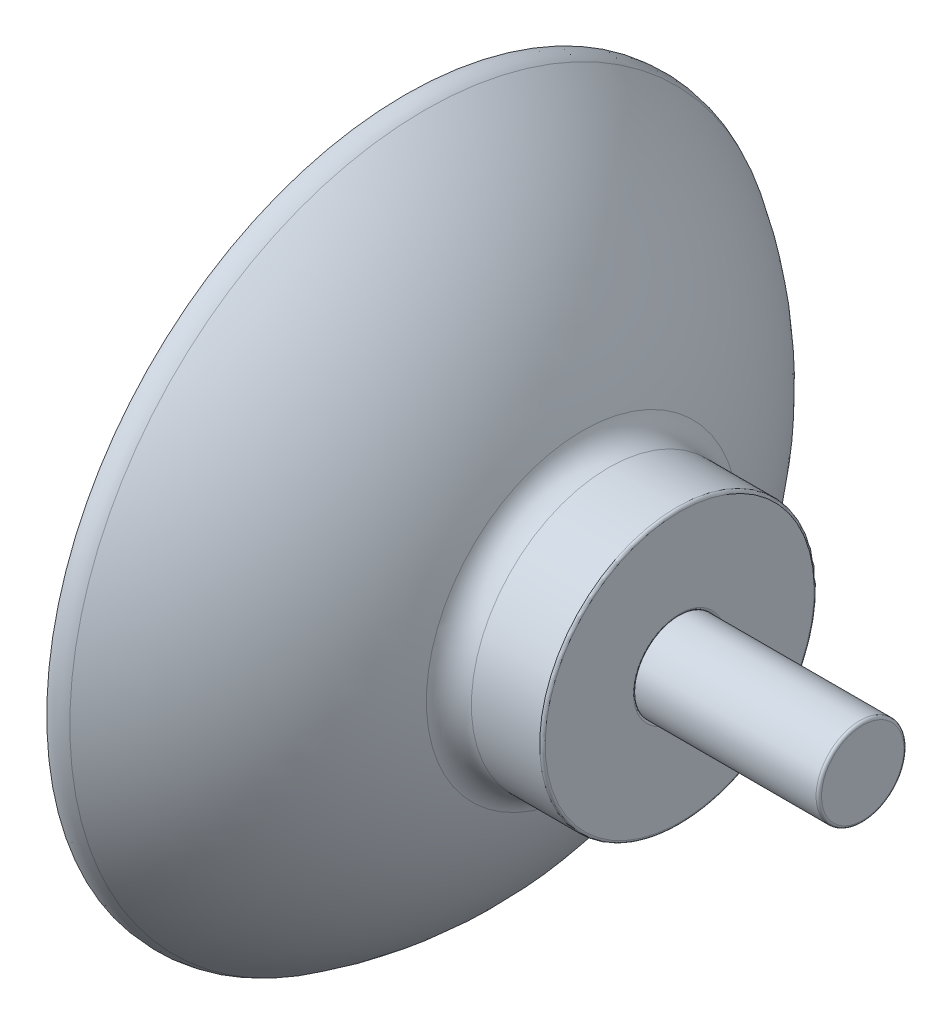
ISO-10303-21;
HEADER;
FILE_DESCRIPTION(('STEP AP214'),'2;1');
FILE_NAME('part.step','',(''),(''),'','','');
FILE_SCHEMA(('AUTOMOTIVE_DESIGN { 1 0 10303 214 1 1 1 1 }'));
ENDSEC;
DATA;
#1=APPLICATION_CONTEXT('core data for automotive mechanical design processes');
#2=APPLICATION_PROTOCOL_DEFINITION('international standard','automotive_design',2000,#1);
#3=PRODUCT_CONTEXT('',#1,'mechanical');
#4=PRODUCT('Part','Part','',(#3));
#5=PRODUCT_RELATED_PRODUCT_CATEGORY('part','',(#4));
#6=PRODUCT_DEFINITION_FORMATION('','',#4);
#7=PRODUCT_DEFINITION_CONTEXT('part definition',#1,'design');
#8=PRODUCT_DEFINITION('design','',#6,#7);
#9=PRODUCT_DEFINITION_SHAPE('','',#8);
#10=(LENGTH_UNIT() NAMED_UNIT(*) SI_UNIT(.MILLI.,.METRE.));
#11=(NAMED_UNIT(*) PLANE_ANGLE_UNIT() SI_UNIT($,.RADIAN.));
#12=(NAMED_UNIT(*) SI_UNIT($,.STERADIAN.) SOLID_ANGLE_UNIT());
#13=UNCERTAINTY_MEASURE_WITH_UNIT(LENGTH_MEASURE(1.E-05),#10,'distance_accuracy_value','');
#14=(GEOMETRIC_REPRESENTATION_CONTEXT(3) GLOBAL_UNCERTAINTY_ASSIGNED_CONTEXT((#13)) GLOBAL_UNIT_ASSIGNED_CONTEXT((#10,
#11,#12)) REPRESENTATION_CONTEXT('',''));
#15=CARTESIAN_POINT('',(0.,0.,0.));
#16=DIRECTION('',(0.,0.,1.));
#17=DIRECTION('',(1.,0.,0.));
#18=AXIS2_PLACEMENT_3D('',#15,#16,#17);
#19=CARTESIAN_POINT('',(5.,0.,0.));
#20=DIRECTION('',(1.,0.,0.));
#21=DIRECTION('',(0.,1.,0.));
#22=AXIS2_PLACEMENT_3D('',#19,#20,#21);
#23=PLANE('',#22);
#24=CARTESIAN_POINT('',(5.,0.,0.));
#25=DIRECTION('',(1.,0.,0.));
#26=DIRECTION('',(0.,1.,0.));
#27=AXIS2_PLACEMENT_3D('',#24,#25,#26);
#28=CIRCLE('',#27,2.525);
#29=CARTESIAN_POINT('',(5.,2.525,0.));
#30=VERTEX_POINT('',#29);
#31=EDGE_CURVE('E66',#30,#30,#28,.F.);
#32=ORIENTED_EDGE('',*,*,#31,.T.);
#33=EDGE_LOOP('',(#32));
#34=FACE_BOUND('',#33,.T.);
#35=CARTESIAN_POINT('',(5.,0.,0.));
#36=DIRECTION('',(1.,0.,0.));
#37=DIRECTION('',(0.,1.,0.));
#38=AXIS2_PLACEMENT_3D('',#35,#36,#37);
#39=CIRCLE('',#38,7.35);
#40=CARTESIAN_POINT('',(5.,7.35,0.));
#41=VERTEX_POINT('',#40);
#42=EDGE_CURVE('E69',#41,#41,#39,.T.);
#43=ORIENTED_EDGE('',*,*,#42,.T.);
#44=EDGE_LOOP('',(#43));
#45=FACE_BOUND('',#44,.T.);
#46=ADVANCED_FACE('F33',(#34,#45),#23,.T.);
#47=CARTESIAN_POINT('',(0.,0.,0.));
#48=DIRECTION('',(1.,0.,0.));
#49=DIRECTION('',(0.,1.,0.));
#50=AXIS2_PLACEMENT_3D('',#47,#48,#49);
#51=CYLINDRICAL_SURFACE('',#50,7.5);
#52=CARTESIAN_POINT('',(1.11723092580122,0.,0.));
#53=DIRECTION('',(1.,0.,0.));
#54=DIRECTION('',(0.,1.,0.));
#55=AXIS2_PLACEMENT_3D('',#52,#53,#54);
#56=CIRCLE('',#55,7.5);
#57=CARTESIAN_POINT('',(1.11723092580122,7.5,0.));
#58=VERTEX_POINT('',#57);
#59=EDGE_CURVE('E54',#58,#58,#56,.T.);
#60=ORIENTED_EDGE('',*,*,#59,.T.);
#61=EDGE_LOOP('',(#60));
#62=FACE_BOUND('',#61,.T.);
#63=CARTESIAN_POINT('',(4.85,0.,0.));
#64=DIRECTION('',(1.,0.,0.));
#65=DIRECTION('',(0.,1.,0.));
#66=AXIS2_PLACEMENT_3D('',#63,#64,#65);
#67=CIRCLE('',#66,7.5);
#68=CARTESIAN_POINT('',(4.85,7.5,0.));
#69=VERTEX_POINT('',#68);
#70=EDGE_CURVE('E63',#69,#69,#67,.F.);
#71=ORIENTED_EDGE('',*,*,#70,.T.);
#72=EDGE_LOOP('',(#71));
#73=FACE_BOUND('',#72,.T.);
#74=ADVANCED_FACE('F137',(#62,#73),#51,.T.);
#75=CARTESIAN_POINT('',(-19.3122304000596,0.,0.));
#76=DIRECTION('',(1.,0.,0.));
#77=DIRECTION('',(0.,1.,0.));
#78=AXIS2_PLACEMENT_3D('',#75,#76,#77);
#79=DEGENERATE_TOROIDAL_SURFACE('',#78,2.30021567995232,20.,.T.);
#80=CARTESIAN_POINT('',(-8.92809859857814,0.,0.));
#81=DIRECTION('',(-1.,0.,0.));
#82=DIRECTION('',(0.,-1.,0.));
#83=AXIS2_PLACEMENT_3D('',#80,#81,#82);
#84=CIRCLE('',#83,19.3931910420554);
#85=CARTESIAN_POINT('',(-8.92809859857814,-19.3931910420554,0.));
#86=VERTEX_POINT('',#85);
#87=EDGE_CURVE('E57',#86,#86,#84,.F.);
#88=ORIENTED_EDGE('',*,*,#87,.T.);
#89=EDGE_LOOP('',(#88));
#90=FACE_BOUND('',#89,.T.);
#91=CARTESIAN_POINT('',(-0.308080329491398,0.,0.));
#92=DIRECTION('',(-1.,0.,0.));
#93=DIRECTION('',(0.,-1.,0.));
#94=AXIS2_PLACEMENT_3D('',#91,#92,#93);
#95=CIRCLE('',#94,8.53257318697341);
#96=CARTESIAN_POINT('',(-0.308080329491397,-8.53257318697341,0.));
#97=VERTEX_POINT('',#96);
#98=EDGE_CURVE('E60',#97,#97,#95,.T.);
#99=ORIENTED_EDGE('',*,*,#98,.T.);
#100=EDGE_LOOP('',(#99));
#101=FACE_BOUND('',#100,.T.);
#102=ADVANCED_FACE('F143',(#90,#101),#79,.T.);
#103=CARTESIAN_POINT('',(-21.7835977429209,0.,0.));
#104=DIRECTION('',(1.,0.,0.));
#105=DIRECTION('',(0.,1.,0.));
#106=AXIS2_PLACEMENT_3D('',#103,#104,#105);
#107=DEGENERATE_TOROIDAL_SURFACE('',#106,0.921872423922007,22.,.T.);
#108=CARTESIAN_POINT('',(-9.93081443166763,0.,0.));
#109=DIRECTION('',(-1.,0.,0.));
#110=DIRECTION('',(0.,-1.,0.));
#111=AXIS2_PLACEMENT_3D('',#108,#109,#110);
#112=CIRCLE('',#111,19.4559364082854);
#113=CARTESIAN_POINT('',(-9.93081443166763,-19.4559364082854,0.));
#114=VERTEX_POINT('',#113);
#115=EDGE_CURVE('E78',#114,#114,#112,.T.);
#116=ORIENTED_EDGE('',*,*,#115,.T.);
#117=EDGE_LOOP('',(#116));
#118=FACE_BOUND('',#117,.T.);
#119=CARTESIAN_POINT('',(-0.0014855990188474,0.,0.));
#120=DIRECTION('',(-1.,0.,0.));
#121=DIRECTION('',(0.,-1.,0.));
#122=AXIS2_PLACEMENT_3D('',#119,#120,#121);
#123=CIRCLE('',#122,4.01049518341775);
#124=CARTESIAN_POINT('',(-0.00148559901884691,-4.01049518341775,0.));
#125=VERTEX_POINT('',#124);
#126=EDGE_CURVE('E81',#125,#125,#123,.F.);
#127=ORIENTED_EDGE('',*,*,#126,.T.);
#128=EDGE_LOOP('',(#127));
#129=FACE_BOUND('',#128,.T.);
#130=ADVANCED_FACE('F157',(#118,#129),#107,.F.);
#131=CARTESIAN_POINT('',(0.,0.,0.));
#132=DIRECTION('',(1.,0.,0.));
#133=DIRECTION('',(0.,1.,0.));
#134=AXIS2_PLACEMENT_3D('',#131,#132,#133);
#135=PLANE('',#134);
#136=CARTESIAN_POINT('',(0.,0.,0.));
#137=DIRECTION('',(1.,0.,0.));
#138=DIRECTION('',(0.,1.,0.));
#139=AXIS2_PLACEMENT_3D('',#136,#137,#138);
#140=CIRCLE('',#139,3.98943639187573);
#141=CARTESIAN_POINT('',(0.,3.98943639187573,0.));
#142=VERTEX_POINT('',#141);
#143=EDGE_CURVE('E75',#142,#142,#140,.F.);
#144=ORIENTED_EDGE('',*,*,#143,.T.);
#145=EDGE_LOOP('',(#144));
#146=FACE_BOUND('',#145,.T.);
#147=ADVANCED_FACE('F150',(#146),#135,.F.);
#148=CARTESIAN_POINT('',(-9.85,0.,0.));
#149=DIRECTION('',(-1.,0.,0.));
#150=DIRECTION('',(0.,-1.,0.));
#151=AXIS2_PLACEMENT_3D('',#148,#149,#150);
#152=TOROIDAL_SURFACE('',#151,19.5823050263606,0.15);
#153=ORIENTED_EDGE('',*,*,#115,.F.);
#154=EDGE_LOOP('',(#153));
#155=FACE_BOUND('',#154,.T.);
#156=CARTESIAN_POINT('',(-10.,0.,0.));
#157=DIRECTION('',(-1.,0.,0.));
#158=DIRECTION('',(0.,-1.,0.));
#159=AXIS2_PLACEMENT_3D('',#156,#157,#158);
#160=CIRCLE('',#159,19.5823050263606);
#161=CARTESIAN_POINT('',(-10.,-19.5823050263606,0.));
#162=VERTEX_POINT('',#161);
#163=EDGE_CURVE('E84',#162,#162,#160,.F.);
#164=ORIENTED_EDGE('',*,*,#163,.F.);
#165=EDGE_LOOP('',(#164));
#166=FACE_BOUND('',#165,.T.);
#167=ADVANCED_FACE('F148',(#155,#166),#152,.T.);
#168=CARTESIAN_POINT('',(-0.150000000000001,0.,0.));
#169=DIRECTION('',(1.,0.,0.));
#170=DIRECTION('',(0.,1.,0.));
#171=AXIS2_PLACEMENT_3D('',#168,#169,#170);
#172=TOROIDAL_SURFACE('',#171,3.98943639187573,0.15);
#173=ORIENTED_EDGE('',*,*,#143,.F.);
#174=EDGE_LOOP('',(#173));
#175=FACE_BOUND('',#174,.T.);
#176=ORIENTED_EDGE('',*,*,#126,.F.);
#177=EDGE_LOOP('',(#176));
#178=FACE_BOUND('',#177,.T.);
#179=ADVANCED_FACE('F113',(#175,#178),#172,.F.);
#180=CARTESIAN_POINT('',(4.85,0.,0.));
#181=DIRECTION('',(1.,0.,0.));
#182=DIRECTION('',(0.,1.,0.));
#183=AXIS2_PLACEMENT_3D('',#180,#181,#182);
#184=TOROIDAL_SURFACE('',#183,2.525,0.15);
#185=CARTESIAN_POINT('',(4.93291561975889,0.,0.));
#186=DIRECTION('',(-1.,0.,0.));
#187=DIRECTION('',(0.,-1.,0.));
#188=AXIS2_PLACEMENT_3D('',#185,#186,#187);
#189=CIRCLE('',#188,2.4);
#190=CARTESIAN_POINT('',(4.93291561975889,-2.4,0.));
#191=VERTEX_POINT('',#190);
#192=EDGE_CURVE('E49',#191,#191,#189,.F.);
#193=ORIENTED_EDGE('',*,*,#192,.F.);
#194=EDGE_LOOP('',(#193));
#195=FACE_BOUND('',#194,.T.);
#196=ORIENTED_EDGE('',*,*,#31,.F.);
#197=EDGE_LOOP('',(#196));
#198=FACE_BOUND('',#197,.T.);
#199=ADVANCED_FACE('F115',(#195,#198),#184,.T.);
#200=CARTESIAN_POINT('',(4.85,0.,0.));
#201=DIRECTION('',(1.,0.,0.));
#202=DIRECTION('',(0.,1.,0.));
#203=AXIS2_PLACEMENT_3D('',#200,#201,#202);
#204=TOROIDAL_SURFACE('',#203,7.35,0.15);
#205=ORIENTED_EDGE('',*,*,#70,.F.);
#206=EDGE_LOOP('',(#205));
#207=FACE_BOUND('',#206,.T.);
#208=ORIENTED_EDGE('',*,*,#42,.F.);
#209=EDGE_LOOP('',(#208));
#210=FACE_BOUND('',#209,.T.);
#211=ADVANCED_FACE('F118',(#207,#210),#204,.T.);
#212=CARTESIAN_POINT('',(-9.70690848368925,0.,0.));
#213=DIRECTION('',(-1.,0.,0.));
#214=DIRECTION('',(0.,-1.,0.));
#215=AXIS2_PLACEMENT_3D('',#212,#213,#214);
#216=TOROIDAL_SURFACE('',#215,18.1112178898976,1.5);
#217=ORIENTED_EDGE('',*,*,#163,.T.);
#218=EDGE_LOOP('',(#217));
#219=FACE_BOUND('',#218,.T.);
#220=ORIENTED_EDGE('',*,*,#87,.F.);
#221=EDGE_LOOP('',(#220));
#222=FACE_BOUND('',#221,.T.);
#223=ADVANCED_FACE('F122',(#219,#222),#216,.T.);
#224=CARTESIAN_POINT('',(1.11723092580122,0.,0.));
#225=DIRECTION('',(1.,0.,0.));
#226=DIRECTION('',(0.,1.,0.));
#227=AXIS2_PLACEMENT_3D('',#224,#225,#226);
#228=TOROIDAL_SURFACE('',#227,9.,1.5);
#229=ORIENTED_EDGE('',*,*,#98,.F.);
#230=EDGE_LOOP('',(#229));
#231=FACE_BOUND('',#230,.T.);
#232=ORIENTED_EDGE('',*,*,#59,.F.);
#233=EDGE_LOOP('',(#232));
#234=FACE_BOUND('',#233,.T.);
#235=ADVANCED_FACE('F125',(#231,#234),#228,.F.);
#236=CARTESIAN_POINT('',(15.,2.4,0.));
#237=DIRECTION('',(1.,0.,0.));
#238=DIRECTION('',(0.,1.,0.));
#239=AXIS2_PLACEMENT_3D('',#236,#237,#238);
#240=PLANE('',#239);
#241=CARTESIAN_POINT('',(15.,0.,0.));
#242=DIRECTION('',(1.,0.,0.));
#243=DIRECTION('',(0.,1.,0.));
#244=AXIS2_PLACEMENT_3D('',#241,#242,#243);
#245=CIRCLE('',#244,2.25);
#246=CARTESIAN_POINT('',(15.,2.25,0.));
#247=VERTEX_POINT('',#246);
#248=EDGE_CURVE('E41',#247,#247,#245,.T.);
#249=ORIENTED_EDGE('',*,*,#248,.T.);
#250=EDGE_LOOP('',(#249));
#251=FACE_BOUND('',#250,.T.);
#252=ADVANCED_FACE('F128',(#251),#240,.T.);
#253=CARTESIAN_POINT('',(15.,0.,0.));
#254=DIRECTION('',(1.,0.,0.));
#255=DIRECTION('',(0.,1.,0.));
#256=AXIS2_PLACEMENT_3D('',#253,#254,#255);
#257=CYLINDRICAL_SURFACE('',#256,2.4);
#258=CARTESIAN_POINT('',(14.85,0.,0.));
#259=DIRECTION('',(1.,0.,0.));
#260=DIRECTION('',(0.,1.,0.));
#261=AXIS2_PLACEMENT_3D('',#258,#259,#260);
#262=CIRCLE('',#261,2.4);
#263=CARTESIAN_POINT('',(14.85,2.4,0.));
#264=VERTEX_POINT('',#263);
#265=EDGE_CURVE('E10',#264,#264,#262,.F.);
#266=ORIENTED_EDGE('',*,*,#265,.T.);
#267=EDGE_LOOP('',(#266));
#268=FACE_BOUND('',#267,.T.);
#269=ORIENTED_EDGE('',*,*,#192,.T.);
#270=EDGE_LOOP('',(#269));
#271=FACE_BOUND('',#270,.T.);
#272=ADVANCED_FACE('F109',(#268,#271),#257,.T.);
#273=CARTESIAN_POINT('',(14.85,0.,0.));
#274=DIRECTION('',(1.,0.,0.));
#275=DIRECTION('',(0.,1.,0.));
#276=AXIS2_PLACEMENT_3D('',#273,#274,#275);
#277=TOROIDAL_SURFACE('',#276,2.25,0.15);
#278=ORIENTED_EDGE('',*,*,#265,.F.);
#279=EDGE_LOOP('',(#278));
#280=FACE_BOUND('',#279,.T.);
#281=ORIENTED_EDGE('',*,*,#248,.F.);
#282=EDGE_LOOP('',(#281));
#283=FACE_BOUND('',#282,.T.);
#284=ADVANCED_FACE('F35',(#280,#283),#277,.T.);
#285=CLOSED_SHELL('',(#46,#74,#102,#130,#147,#167,#179,#199,#211,#223,#235,#252,#272,#284));
#286=CARTESIAN_POINT('',(4.,4.75,0.));
#287=DIRECTION('',(1.,0.,0.));
#288=DIRECTION('',(0.,1.,0.));
#289=AXIS2_PLACEMENT_3D('',#286,#287,#288);
#290=PLANE('',#289);
#291=CARTESIAN_POINT('',(4.,0.,0.));
#292=DIRECTION('',(1.,0.,0.));
#293=DIRECTION('',(0.,1.,0.));
#294=AXIS2_PLACEMENT_3D('',#291,#292,#293);
#295=CIRCLE('',#294,2.4);
#296=CARTESIAN_POINT('',(4.,2.4,0.));
#297=VERTEX_POINT('',#296);
#298=EDGE_CURVE('E86',#297,#297,#295,.T.);
#299=ORIENTED_EDGE('',*,*,#298,.F.);
#300=EDGE_LOOP('',(#299));
#301=FACE_BOUND('',#300,.T.);
#302=CARTESIAN_POINT('',(4.,0.,0.));
#303=DIRECTION('',(1.,0.,0.));
#304=DIRECTION('',(0.,1.,0.));
#305=AXIS2_PLACEMENT_3D('',#302,#303,#304);
#306=CIRCLE('',#305,2.525);
#307=CARTESIAN_POINT('',(4.,2.525,0.));
#308=VERTEX_POINT('',#307);
#309=EDGE_CURVE('E72',#308,#308,#306,.T.);
#310=ORIENTED_EDGE('',*,*,#309,.T.);
#311=EDGE_LOOP('',(#310));
#312=FACE_BOUND('',#311,.T.);
#313=ADVANCED_FACE('F93',(#301,#312),#290,.T.);
#314=CARTESIAN_POINT('',(4.06708438024112,0.,0.));
#315=DIRECTION('',(1.,0.,0.));
#316=DIRECTION('',(0.,1.,0.));
#317=AXIS2_PLACEMENT_3D('',#314,#315,#316);
#318=CIRCLE('',#317,2.4);
#319=CARTESIAN_POINT('',(4.06708438024112,2.4,0.));
#320=VERTEX_POINT('',#319);
#321=EDGE_CURVE('E45',#320,#320,#318,.F.);
#322=ORIENTED_EDGE('',*,*,#321,.T.);
#323=EDGE_LOOP('',(#322));
#324=FACE_BOUND('',#323,.T.);
#325=ORIENTED_EDGE('',*,*,#298,.T.);
#326=EDGE_LOOP('',(#325));
#327=FACE_BOUND('',#326,.T.);
#328=ADVANCED_FACE('F91',(#324,#327),#257,.T.);
#329=CARTESIAN_POINT('',(4.15,0.,0.));
#330=DIRECTION('',(1.,0.,0.));
#331=DIRECTION('',(0.,1.,0.));
#332=AXIS2_PLACEMENT_3D('',#329,#330,#331);
#333=TOROIDAL_SURFACE('',#332,2.525,0.15);
#334=ORIENTED_EDGE('',*,*,#321,.F.);
#335=EDGE_LOOP('',(#334));
#336=FACE_BOUND('',#335,.T.);
#337=ORIENTED_EDGE('',*,*,#309,.F.);
#338=EDGE_LOOP('',(#337));
#339=FACE_BOUND('',#338,.T.);
#340=ADVANCED_FACE('F100',(#336,#339),#333,.T.);
#341=CLOSED_SHELL('',(#313,#328,#340));
#342=ORIENTED_CLOSED_SHELL('',*,#341,.T.);
#343=BREP_WITH_VOIDS('B2',#285,(#342));
#344=ADVANCED_BREP_SHAPE_REPRESENTATION('',(#18,#343),#14);
#345=SHAPE_DEFINITION_REPRESENTATION(#9,#344);
ENDSEC;
END-ISO-10303-21;
